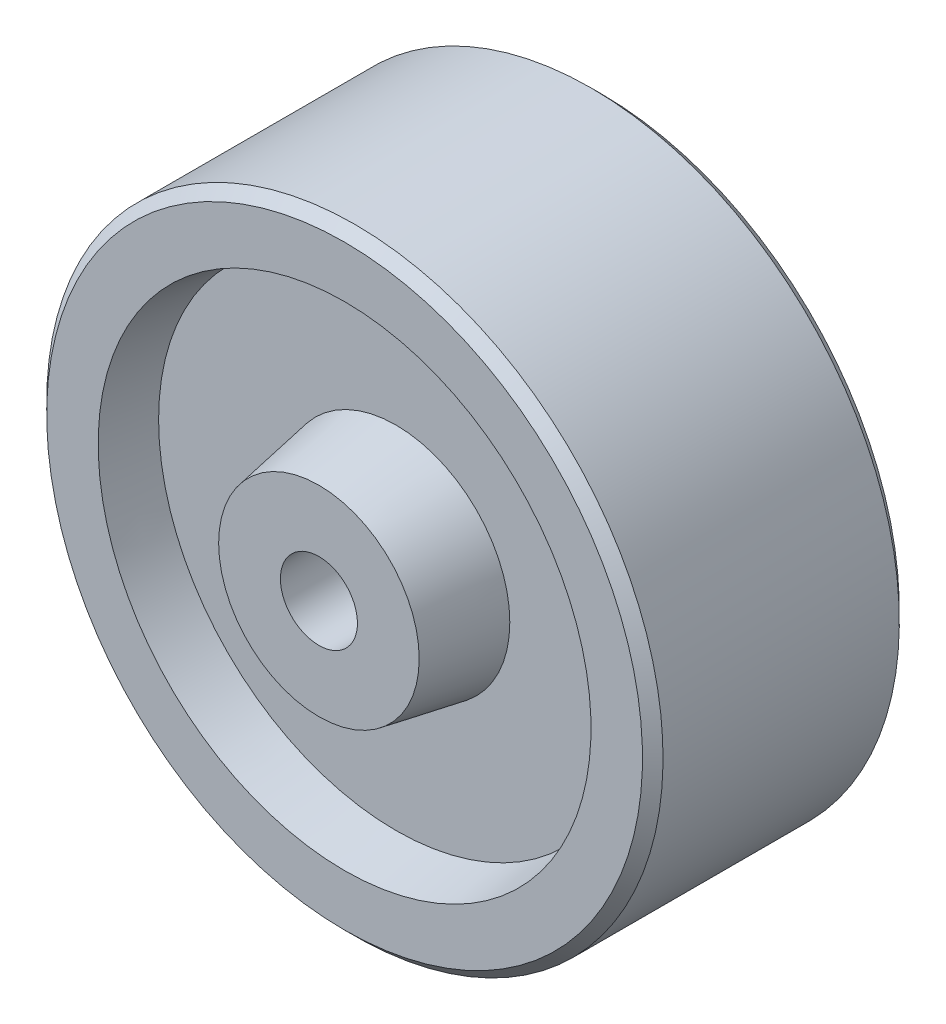
ISO-10303-21;
HEADER;
FILE_DESCRIPTION(('STEP AP214'),'2;1');
FILE_NAME('part.step','',(''),(''),'','','');
FILE_SCHEMA(('AUTOMOTIVE_DESIGN { 1 0 10303 214 1 1 1 1 }'));
ENDSEC;
DATA;
#1=APPLICATION_CONTEXT('core data for automotive mechanical design processes');
#2=APPLICATION_PROTOCOL_DEFINITION('international standard','automotive_design',2000,#1);
#3=PRODUCT_CONTEXT('',#1,'mechanical');
#4=PRODUCT('Part','Part','',(#3));
#5=PRODUCT_RELATED_PRODUCT_CATEGORY('part','',(#4));
#6=PRODUCT_DEFINITION_FORMATION('','',#4);
#7=PRODUCT_DEFINITION_CONTEXT('part definition',#1,'design');
#8=PRODUCT_DEFINITION('design','',#6,#7);
#9=PRODUCT_DEFINITION_SHAPE('','',#8);
#10=(LENGTH_UNIT() NAMED_UNIT(*) SI_UNIT(.MILLI.,.METRE.));
#11=(NAMED_UNIT(*) PLANE_ANGLE_UNIT() SI_UNIT($,.RADIAN.));
#12=(NAMED_UNIT(*) SI_UNIT($,.STERADIAN.) SOLID_ANGLE_UNIT());
#13=UNCERTAINTY_MEASURE_WITH_UNIT(LENGTH_MEASURE(1.E-05),#10,'distance_accuracy_value','');
#14=(GEOMETRIC_REPRESENTATION_CONTEXT(3) GLOBAL_UNCERTAINTY_ASSIGNED_CONTEXT((#13)) GLOBAL_UNIT_ASSIGNED_CONTEXT((#10,
#11,#12)) REPRESENTATION_CONTEXT('',''));
#15=CARTESIAN_POINT('',(0.,0.,0.));
#16=DIRECTION('',(0.,0.,1.));
#17=DIRECTION('',(1.,0.,0.));
#18=AXIS2_PLACEMENT_3D('',#15,#16,#17);
#19=CARTESIAN_POINT('',(0.,0.,19.05));
#20=DIRECTION('',(0.,0.,1.));
#21=DIRECTION('',(0.,-1.,0.));
#22=AXIS2_PLACEMENT_3D('',#19,#20,#21);
#23=CYLINDRICAL_SURFACE('',#22,38.1);
#24=CARTESIAN_POINT('',(0.,0.,14.605));
#25=DIRECTION('',(0.,0.,-1.));
#26=DIRECTION('',(0.,1.,0.));
#27=AXIS2_PLACEMENT_3D('',#24,#25,#26);
#28=CIRCLE('',#27,38.1);
#29=CARTESIAN_POINT('',(0.,38.1,14.605));
#30=VERTEX_POINT('',#29);
#31=EDGE_CURVE('E10',#30,#30,#28,.T.);
#32=ORIENTED_EDGE('',*,*,#31,.T.);
#33=EDGE_LOOP('',(#32));
#34=FACE_BOUND('',#33,.T.);
#35=CARTESIAN_POINT('',(0.,0.,-14.605));
#36=DIRECTION('',(0.,0.,-1.));
#37=DIRECTION('',(0.,1.,0.));
#38=AXIS2_PLACEMENT_3D('',#35,#36,#37);
#39=CIRCLE('',#38,38.1);
#40=CARTESIAN_POINT('',(0.,38.1,-14.605));
#41=VERTEX_POINT('',#40);
#42=EDGE_CURVE('E59',#41,#41,#39,.T.);
#43=ORIENTED_EDGE('',*,*,#42,.F.);
#44=EDGE_LOOP('',(#43));
#45=FACE_BOUND('',#44,.T.);
#46=ADVANCED_FACE('F30',(#34,#45),#23,.T.);
#47=CARTESIAN_POINT('',(0.,38.1,15.875));
#48=DIRECTION('',(0.,0.,-1.));
#49=DIRECTION('',(0.,1.,0.));
#50=AXIS2_PLACEMENT_3D('',#47,#48,#49);
#51=PLANE('',#50);
#52=CARTESIAN_POINT('',(0.,0.,15.875));
#53=DIRECTION('',(0.,0.,-1.));
#54=DIRECTION('',(0.,1.,0.));
#55=AXIS2_PLACEMENT_3D('',#52,#53,#54);
#56=CIRCLE('',#55,36.83);
#57=CARTESIAN_POINT('',(0.,36.83,15.875));
#58=VERTEX_POINT('',#57);
#59=EDGE_CURVE('E37',#58,#58,#56,.F.);
#60=ORIENTED_EDGE('',*,*,#59,.T.);
#61=EDGE_LOOP('',(#60));
#62=FACE_BOUND('',#61,.T.);
#63=CARTESIAN_POINT('',(0.,0.,15.875));
#64=DIRECTION('',(0.,0.,1.));
#65=DIRECTION('',(0.,-1.,0.));
#66=AXIS2_PLACEMENT_3D('',#63,#64,#65);
#67=CIRCLE('',#66,30.4654227046867);
#68=CARTESIAN_POINT('',(0.,-30.4654227046867,15.875));
#69=VERTEX_POINT('',#68);
#70=EDGE_CURVE('E41',#69,#69,#67,.T.);
#71=ORIENTED_EDGE('',*,*,#70,.F.);
#72=EDGE_LOOP('',(#71));
#73=FACE_BOUND('',#72,.T.);
#74=ADVANCED_FACE('F100',(#62,#73),#51,.F.);
#75=CARTESIAN_POINT('',(0.,0.,15.875));
#76=DIRECTION('',(0.,0.,1.));
#77=DIRECTION('',(0.,-1.,0.));
#78=AXIS2_PLACEMENT_3D('',#75,#76,#77);
#79=CONICAL_SURFACE('',#78,30.4654227046867,0.174532925199429);
#80=CARTESIAN_POINT('',(0.,0.,9.52499999999999));
#81=DIRECTION('',(0.,0.,1.));
#82=DIRECTION('',(0.,-1.,0.));
#83=AXIS2_PLACEMENT_3D('',#80,#81,#82);
#84=CIRCLE('',#83,29.345746377188);
#85=CARTESIAN_POINT('',(0.,-29.345746377188,9.52499999999999));
#86=VERTEX_POINT('',#85);
#87=EDGE_CURVE('E45',#86,#86,#84,.T.);
#88=ORIENTED_EDGE('',*,*,#87,.F.);
#89=EDGE_LOOP('',(#88));
#90=FACE_BOUND('',#89,.T.);
#91=ORIENTED_EDGE('',*,*,#70,.T.);
#92=EDGE_LOOP('',(#91));
#93=FACE_BOUND('',#92,.T.);
#94=ADVANCED_FACE('F104',(#90,#93),#79,.F.);
#95=CARTESIAN_POINT('',(0.,21.7111690818747,9.525));
#96=DIRECTION('',(0.,0.,-1.));
#97=DIRECTION('',(0.,1.,0.));
#98=AXIS2_PLACEMENT_3D('',#95,#96,#97);
#99=PLANE('',#98);
#100=CARTESIAN_POINT('',(0.,0.,9.525));
#101=DIRECTION('',(0.,0.,1.));
#102=DIRECTION('',(0.,-1.,0.));
#103=AXIS2_PLACEMENT_3D('',#100,#101,#102);
#104=CIRCLE('',#103,14.0765917865614);
#105=CARTESIAN_POINT('',(0.,-14.0765917865614,9.52499999999999));
#106=VERTEX_POINT('',#105);
#107=EDGE_CURVE('E50',#106,#106,#104,.T.);
#108=ORIENTED_EDGE('',*,*,#107,.F.);
#109=EDGE_LOOP('',(#108));
#110=FACE_BOUND('',#109,.T.);
#111=ORIENTED_EDGE('',*,*,#87,.T.);
#112=EDGE_LOOP('',(#111));
#113=FACE_BOUND('',#112,.T.);
#114=ADVANCED_FACE('F110',(#110,#113),#99,.F.);
#115=CARTESIAN_POINT('',(0.,0.,9.525));
#116=DIRECTION('',(0.,0.,-1.));
#117=DIRECTION('',(0.,1.,0.));
#118=AXIS2_PLACEMENT_3D('',#115,#116,#117);
#119=CONICAL_SURFACE('',#118,14.0765917865614,0.17453292519943);
#120=CARTESIAN_POINT('',(0.,0.,19.05));
#121=DIRECTION('',(0.,0.,1.));
#122=DIRECTION('',(0.,-1.,0.));
#123=AXIS2_PLACEMENT_3D('',#120,#121,#122);
#124=CIRCLE('',#123,12.3970772953133);
#125=CARTESIAN_POINT('',(0.,-12.3970772953133,19.05));
#126=VERTEX_POINT('',#125);
#127=EDGE_CURVE('E53',#126,#126,#124,.T.);
#128=ORIENTED_EDGE('',*,*,#127,.F.);
#129=EDGE_LOOP('',(#128));
#130=FACE_BOUND('',#129,.T.);
#131=ORIENTED_EDGE('',*,*,#107,.T.);
#132=EDGE_LOOP('',(#131));
#133=FACE_BOUND('',#132,.T.);
#134=ADVANCED_FACE('F95',(#130,#133),#119,.T.);
#135=CARTESIAN_POINT('',(0.,12.3970772953133,19.05));
#136=DIRECTION('',(0.,0.,-1.));
#137=DIRECTION('',(0.,1.,0.));
#138=AXIS2_PLACEMENT_3D('',#135,#136,#137);
#139=PLANE('',#138);
#140=CARTESIAN_POINT('',(0.,0.,19.05));
#141=DIRECTION('',(0.,0.,1.));
#142=DIRECTION('',(0.,-1.,0.));
#143=AXIS2_PLACEMENT_3D('',#140,#141,#142);
#144=CIRCLE('',#143,4.7625);
#145=CARTESIAN_POINT('',(0.,-4.7625,19.05));
#146=VERTEX_POINT('',#145);
#147=EDGE_CURVE('E56',#146,#146,#144,.T.);
#148=ORIENTED_EDGE('',*,*,#147,.F.);
#149=EDGE_LOOP('',(#148));
#150=FACE_BOUND('',#149,.T.);
#151=ORIENTED_EDGE('',*,*,#127,.T.);
#152=EDGE_LOOP('',(#151));
#153=FACE_BOUND('',#152,.T.);
#154=ADVANCED_FACE('F86',(#150,#153),#139,.F.);
#155=CARTESIAN_POINT('',(0.,0.,19.05));
#156=DIRECTION('',(0.,0.,1.));
#157=DIRECTION('',(0.,-1.,0.));
#158=AXIS2_PLACEMENT_3D('',#155,#156,#157);
#159=CYLINDRICAL_SURFACE('',#158,4.7625);
#160=ORIENTED_EDGE('',*,*,#147,.T.);
#161=EDGE_LOOP('',(#160));
#162=FACE_BOUND('',#161,.T.);
#163=CARTESIAN_POINT('',(0.,0.,-19.05));
#164=DIRECTION('',(0.,0.,1.));
#165=DIRECTION('',(0.,-1.,0.));
#166=AXIS2_PLACEMENT_3D('',#163,#164,#165);
#167=CIRCLE('',#166,4.7625);
#168=CARTESIAN_POINT('',(0.,-4.7625,-19.05));
#169=VERTEX_POINT('',#168);
#170=EDGE_CURVE('E77',#169,#169,#167,.T.);
#171=ORIENTED_EDGE('',*,*,#170,.F.);
#172=EDGE_LOOP('',(#171));
#173=FACE_BOUND('',#172,.T.);
#174=ADVANCED_FACE('F84',(#162,#173),#159,.F.);
#175=CARTESIAN_POINT('',(0.,0.,15.875));
#176=DIRECTION('',(0.,0.,-1.));
#177=DIRECTION('',(0.,1.,0.));
#178=AXIS2_PLACEMENT_3D('',#175,#176,#177);
#179=CONICAL_SURFACE('',#178,36.83,0.785398163397446);
#180=ORIENTED_EDGE('',*,*,#31,.F.);
#181=EDGE_LOOP('',(#180));
#182=FACE_BOUND('',#181,.T.);
#183=ORIENTED_EDGE('',*,*,#59,.F.);
#184=EDGE_LOOP('',(#183));
#185=FACE_BOUND('',#184,.T.);
#186=ADVANCED_FACE('F32',(#182,#185),#179,.T.);
#187=CARTESIAN_POINT('',(0.,38.1,-15.875));
#188=DIRECTION('',(0.,0.,1.));
#189=DIRECTION('',(0.,1.,0.));
#190=AXIS2_PLACEMENT_3D('',#187,#188,#189);
#191=PLANE('',#190);
#192=CARTESIAN_POINT('',(0.,0.,-15.875));
#193=DIRECTION('',(0.,0.,-1.));
#194=DIRECTION('',(0.,1.,0.));
#195=AXIS2_PLACEMENT_3D('',#192,#193,#194);
#196=CIRCLE('',#195,36.83);
#197=CARTESIAN_POINT('',(0.,36.83,-15.875));
#198=VERTEX_POINT('',#197);
#199=EDGE_CURVE('E62',#198,#198,#196,.F.);
#200=ORIENTED_EDGE('',*,*,#199,.F.);
#201=EDGE_LOOP('',(#200));
#202=FACE_BOUND('',#201,.T.);
#203=CARTESIAN_POINT('',(0.,0.,-15.875));
#204=DIRECTION('',(0.,0.,1.));
#205=DIRECTION('',(0.,-1.,0.));
#206=AXIS2_PLACEMENT_3D('',#203,#204,#205);
#207=CIRCLE('',#206,30.4654227046867);
#208=CARTESIAN_POINT('',(0.,-30.4654227046867,-15.875));
#209=VERTEX_POINT('',#208);
#210=EDGE_CURVE('E65',#209,#209,#207,.T.);
#211=ORIENTED_EDGE('',*,*,#210,.T.);
#212=EDGE_LOOP('',(#211));
#213=FACE_BOUND('',#212,.T.);
#214=ADVANCED_FACE('F93',(#202,#213),#191,.F.);
#215=CARTESIAN_POINT('',(0.,0.,-15.875));
#216=DIRECTION('',(0.,0.,-1.));
#217=DIRECTION('',(0.,-1.,0.));
#218=AXIS2_PLACEMENT_3D('',#215,#216,#217);
#219=CONICAL_SURFACE('',#218,30.4654227046867,0.174532925199429);
#220=CARTESIAN_POINT('',(0.,0.,-9.52499999999999));
#221=DIRECTION('',(0.,0.,1.));
#222=DIRECTION('',(0.,-1.,0.));
#223=AXIS2_PLACEMENT_3D('',#220,#221,#222);
#224=CIRCLE('',#223,29.345746377188);
#225=CARTESIAN_POINT('',(0.,-29.345746377188,-9.52499999999999));
#226=VERTEX_POINT('',#225);
#227=EDGE_CURVE('E68',#226,#226,#224,.T.);
#228=ORIENTED_EDGE('',*,*,#227,.T.);
#229=EDGE_LOOP('',(#228));
#230=FACE_BOUND('',#229,.T.);
#231=ORIENTED_EDGE('',*,*,#210,.F.);
#232=EDGE_LOOP('',(#231));
#233=FACE_BOUND('',#232,.T.);
#234=ADVANCED_FACE('F158',(#230,#233),#219,.F.);
#235=CARTESIAN_POINT('',(0.,21.7111690818747,-9.525));
#236=DIRECTION('',(0.,0.,1.));
#237=DIRECTION('',(0.,1.,0.));
#238=AXIS2_PLACEMENT_3D('',#235,#236,#237);
#239=PLANE('',#238);
#240=CARTESIAN_POINT('',(0.,0.,-9.525));
#241=DIRECTION('',(0.,0.,1.));
#242=DIRECTION('',(0.,-1.,0.));
#243=AXIS2_PLACEMENT_3D('',#240,#241,#242);
#244=CIRCLE('',#243,14.0765917865614);
#245=CARTESIAN_POINT('',(0.,-14.0765917865614,-9.52499999999999));
#246=VERTEX_POINT('',#245);
#247=EDGE_CURVE('E71',#246,#246,#244,.T.);
#248=ORIENTED_EDGE('',*,*,#247,.T.);
#249=EDGE_LOOP('',(#248));
#250=FACE_BOUND('',#249,.T.);
#251=ORIENTED_EDGE('',*,*,#227,.F.);
#252=EDGE_LOOP('',(#251));
#253=FACE_BOUND('',#252,.T.);
#254=ADVANCED_FACE('F167',(#250,#253),#239,.F.);
#255=CARTESIAN_POINT('',(0.,0.,-9.525));
#256=DIRECTION('',(0.,0.,1.));
#257=DIRECTION('',(0.,1.,0.));
#258=AXIS2_PLACEMENT_3D('',#255,#256,#257);
#259=CONICAL_SURFACE('',#258,14.0765917865614,0.17453292519943);
#260=CARTESIAN_POINT('',(0.,0.,-19.05));
#261=DIRECTION('',(0.,0.,1.));
#262=DIRECTION('',(0.,-1.,0.));
#263=AXIS2_PLACEMENT_3D('',#260,#261,#262);
#264=CIRCLE('',#263,12.3970772953133);
#265=CARTESIAN_POINT('',(0.,-12.3970772953133,-19.05));
#266=VERTEX_POINT('',#265);
#267=EDGE_CURVE('E74',#266,#266,#264,.T.);
#268=ORIENTED_EDGE('',*,*,#267,.T.);
#269=EDGE_LOOP('',(#268));
#270=FACE_BOUND('',#269,.T.);
#271=ORIENTED_EDGE('',*,*,#247,.F.);
#272=EDGE_LOOP('',(#271));
#273=FACE_BOUND('',#272,.T.);
#274=ADVANCED_FACE('F176',(#270,#273),#259,.T.);
#275=CARTESIAN_POINT('',(0.,12.3970772953133,-19.05));
#276=DIRECTION('',(0.,0.,1.));
#277=DIRECTION('',(0.,1.,0.));
#278=AXIS2_PLACEMENT_3D('',#275,#276,#277);
#279=PLANE('',#278);
#280=ORIENTED_EDGE('',*,*,#170,.T.);
#281=EDGE_LOOP('',(#280));
#282=FACE_BOUND('',#281,.T.);
#283=ORIENTED_EDGE('',*,*,#267,.F.);
#284=EDGE_LOOP('',(#283));
#285=FACE_BOUND('',#284,.T.);
#286=ADVANCED_FACE('F81',(#282,#285),#279,.F.);
#287=CARTESIAN_POINT('',(0.,0.,-15.875));
#288=DIRECTION('',(0.,0.,1.));
#289=DIRECTION('',(0.,1.,0.));
#290=AXIS2_PLACEMENT_3D('',#287,#288,#289);
#291=CONICAL_SURFACE('',#290,36.83,0.785398163397446);
#292=ORIENTED_EDGE('',*,*,#42,.T.);
#293=EDGE_LOOP('',(#292));
#294=FACE_BOUND('',#293,.T.);
#295=ORIENTED_EDGE('',*,*,#199,.T.);
#296=EDGE_LOOP('',(#295));
#297=FACE_BOUND('',#296,.T.);
#298=ADVANCED_FACE('F196',(#294,#297),#291,.T.);
#299=CLOSED_SHELL('',(#46,#74,#94,#114,#134,#154,#174,#186,#214,#234,#254,#274,#286,#298));
#300=MANIFOLD_SOLID_BREP('B2',#299);
#301=ADVANCED_BREP_SHAPE_REPRESENTATION('',(#18,#300),#14);
#302=SHAPE_DEFINITION_REPRESENTATION(#9,#301);
ENDSEC;
END-ISO-10303-21;
